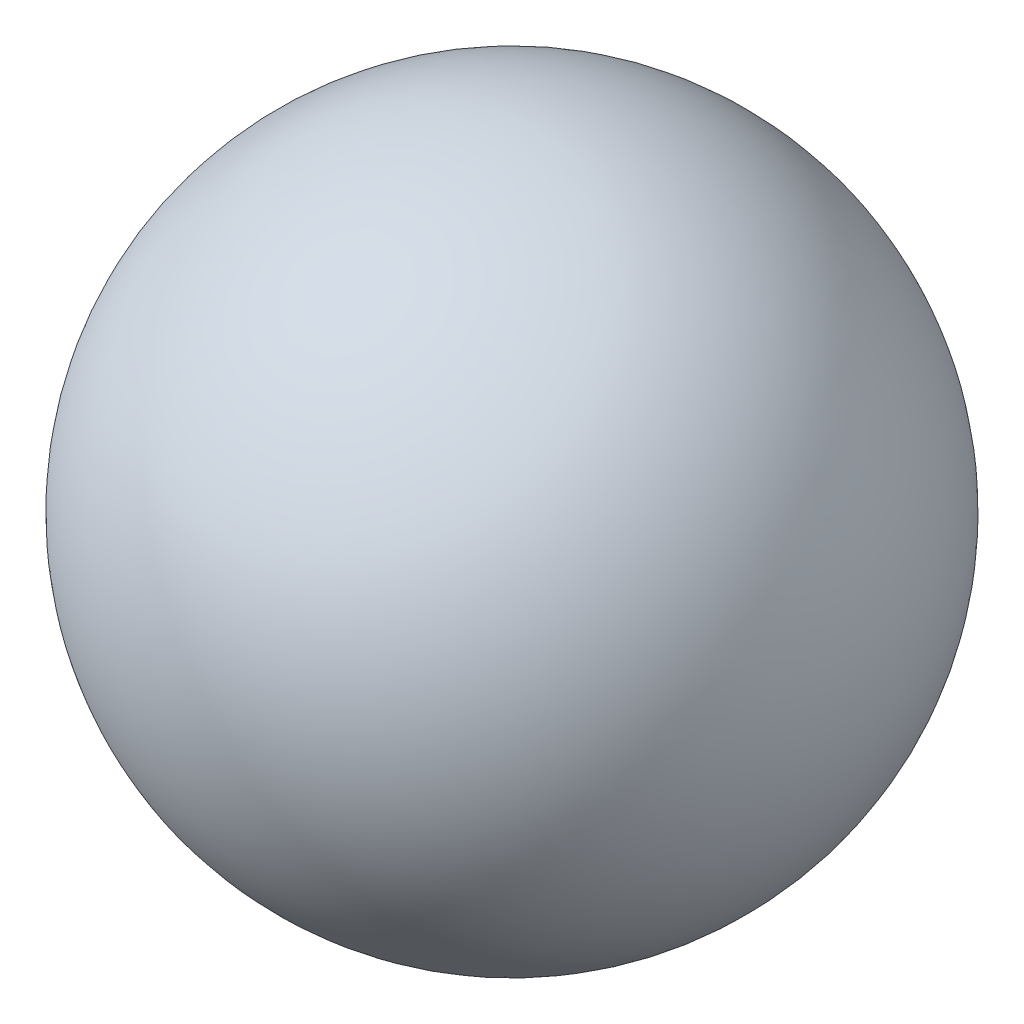
ISO-10303-21;
HEADER;
FILE_DESCRIPTION(('STEP AP214'),'2;1');
FILE_NAME('part.step','',(''),(''),'','','');
FILE_SCHEMA(('AUTOMOTIVE_DESIGN { 1 0 10303 214 1 1 1 1 }'));
ENDSEC;
DATA;
#1=APPLICATION_CONTEXT('core data for automotive mechanical design processes');
#2=APPLICATION_PROTOCOL_DEFINITION('international standard','automotive_design',2000,#1);
#3=PRODUCT_CONTEXT('',#1,'mechanical');
#4=PRODUCT('Part','Part','',(#3));
#5=PRODUCT_RELATED_PRODUCT_CATEGORY('part','',(#4));
#6=PRODUCT_DEFINITION_FORMATION('','',#4);
#7=PRODUCT_DEFINITION_CONTEXT('part definition',#1,'design');
#8=PRODUCT_DEFINITION('design','',#6,#7);
#9=PRODUCT_DEFINITION_SHAPE('','',#8);
#10=(LENGTH_UNIT() NAMED_UNIT(*) SI_UNIT(.MILLI.,.METRE.));
#11=(NAMED_UNIT(*) PLANE_ANGLE_UNIT() SI_UNIT($,.RADIAN.));
#12=(NAMED_UNIT(*) SI_UNIT($,.STERADIAN.) SOLID_ANGLE_UNIT());
#13=UNCERTAINTY_MEASURE_WITH_UNIT(LENGTH_MEASURE(1.E-05),#10,'distance_accuracy_value','');
#14=(GEOMETRIC_REPRESENTATION_CONTEXT(3) GLOBAL_UNCERTAINTY_ASSIGNED_CONTEXT((#13)) GLOBAL_UNIT_ASSIGNED_CONTEXT((#10,
#11,#12)) REPRESENTATION_CONTEXT('',''));
#15=CARTESIAN_POINT('',(0.,0.,0.));
#16=DIRECTION('',(0.,0.,1.));
#17=DIRECTION('',(1.,0.,0.));
#18=AXIS2_PLACEMENT_3D('',#15,#16,#17);
#19=CARTESIAN_POINT('',(0.,0.,0.));
#20=DIRECTION('',(0.,0.,-1.));
#21=DIRECTION('',(1.,0.,0.));
#22=AXIS2_PLACEMENT_3D('',#19,#20,#21);
#23=SPHERICAL_SURFACE('',#22,20.32);
#24=CARTESIAN_POINT('',(0.,0.,-20.32));
#25=VERTEX_POINT('',#24);
#26=VERTEX_LOOP('',#25);
#27=FACE_BOUND('',#26,.T.);
#28=ADVANCED_FACE('F37',(#27),#23,.T.);
#29=CLOSED_SHELL('',(#28));
#30=MANIFOLD_SOLID_BREP('B2',#29);
#31=ADVANCED_BREP_SHAPE_REPRESENTATION('',(#18,#30),#14);
#32=SHAPE_DEFINITION_REPRESENTATION(#9,#31);
ENDSEC;
END-ISO-10303-21;
